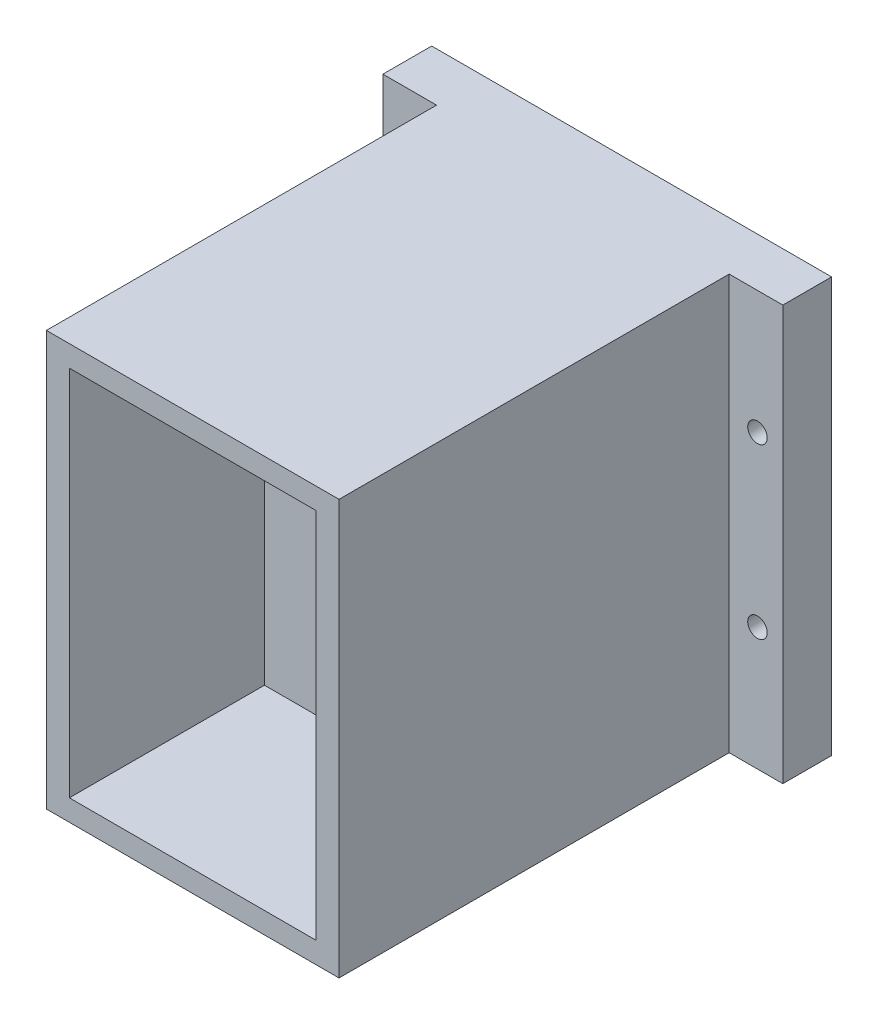
ISO-10303-21;
HEADER;
FILE_DESCRIPTION(('STEP AP214'),'2;1');
FILE_NAME('part.step','',(''),(''),'','','');
FILE_SCHEMA(('AUTOMOTIVE_DESIGN { 1 0 10303 214 1 1 1 1 }'));
ENDSEC;
DATA;
#1=APPLICATION_CONTEXT('core data for automotive mechanical design processes');
#2=APPLICATION_PROTOCOL_DEFINITION('international standard','automotive_design',2000,#1);
#3=PRODUCT_CONTEXT('',#1,'mechanical');
#4=PRODUCT('Part','Part','',(#3));
#5=PRODUCT_RELATED_PRODUCT_CATEGORY('part','',(#4));
#6=PRODUCT_DEFINITION_FORMATION('','',#4);
#7=PRODUCT_DEFINITION_CONTEXT('part definition',#1,'design');
#8=PRODUCT_DEFINITION('design','',#6,#7);
#9=PRODUCT_DEFINITION_SHAPE('','',#8);
#10=(LENGTH_UNIT() NAMED_UNIT(*) SI_UNIT(.MILLI.,.METRE.));
#11=(NAMED_UNIT(*) PLANE_ANGLE_UNIT() SI_UNIT($,.RADIAN.));
#12=(NAMED_UNIT(*) SI_UNIT($,.STERADIAN.) SOLID_ANGLE_UNIT());
#13=UNCERTAINTY_MEASURE_WITH_UNIT(LENGTH_MEASURE(1.E-05),#10,'distance_accuracy_value','');
#14=(GEOMETRIC_REPRESENTATION_CONTEXT(3) GLOBAL_UNCERTAINTY_ASSIGNED_CONTEXT((#13)) GLOBAL_UNIT_ASSIGNED_CONTEXT((#10,
#11,#12)) REPRESENTATION_CONTEXT('',''));
#15=CARTESIAN_POINT('',(0.,0.,0.));
#16=DIRECTION('',(0.,0.,1.));
#17=DIRECTION('',(1.,0.,0.));
#18=AXIS2_PLACEMENT_3D('',#15,#16,#17);
#19=CARTESIAN_POINT('',(-15.,-21.25,40.));
#20=DIRECTION('',(1.,0.,0.));
#21=DIRECTION('',(0.,0.,-1.));
#22=AXIS2_PLACEMENT_3D('',#19,#20,#21);
#23=PLANE('',#22);
#24=DIRECTION('',(0.,-1.,0.));
#25=VECTOR('',#24,1.);
#26=CARTESIAN_POINT('',(-15.,-21.25,0.));
#27=LINE('',#26,#25);
#28=CARTESIAN_POINT('',(-15.,21.25,0.));
#29=VERTEX_POINT('',#28);
#30=CARTESIAN_POINT('',(-15.,-21.25,0.));
#31=VERTEX_POINT('',#30);
#32=EDGE_CURVE('E136',#29,#31,#27,.T.);
#33=ORIENTED_EDGE('',*,*,#32,.T.);
#34=DIRECTION('',(0.,0.,-1.));
#35=VECTOR('',#34,1.);
#36=CARTESIAN_POINT('',(-15.,-21.25,40.));
#37=LINE('',#36,#35);
#38=CARTESIAN_POINT('',(-15.,-21.25,40.));
#39=VERTEX_POINT('',#38);
#40=EDGE_CURVE('E11',#39,#31,#37,.T.);
#41=ORIENTED_EDGE('',*,*,#40,.F.);
#42=DIRECTION('',(0.,-1.,0.));
#43=VECTOR('',#42,1.);
#44=CARTESIAN_POINT('',(-15.,-21.25,40.));
#45=LINE('',#44,#43);
#46=CARTESIAN_POINT('',(-15.,21.25,40.));
#47=VERTEX_POINT('',#46);
#48=EDGE_CURVE('E112',#47,#39,#45,.T.);
#49=ORIENTED_EDGE('',*,*,#48,.F.);
#50=DIRECTION('',(0.,0.,-1.));
#51=VECTOR('',#50,1.);
#52=CARTESIAN_POINT('',(-15.,21.25,40.));
#53=LINE('',#52,#51);
#54=EDGE_CURVE('E132',#47,#29,#53,.T.);
#55=ORIENTED_EDGE('',*,*,#54,.T.);
#56=EDGE_LOOP('',(#33,#41,#49,#55));
#57=FACE_BOUND('',#56,.T.);
#58=ADVANCED_FACE('F40',(#57),#23,.F.);
#59=CARTESIAN_POINT('',(15.,-21.25,40.));
#60=DIRECTION('',(0.,1.,0.));
#61=DIRECTION('',(-1.,0.,0.));
#62=AXIS2_PLACEMENT_3D('',#59,#60,#61);
#63=PLANE('',#62);
#64=ORIENTED_EDGE('',*,*,#40,.T.);
#65=DIRECTION('',(-1.,0.,0.));
#66=VECTOR('',#65,1.);
#67=CARTESIAN_POINT('',(-20.5,-21.25,0.));
#68=LINE('',#67,#66);
#69=CARTESIAN_POINT('',(-20.5,-21.25,0.));
#70=VERTEX_POINT('',#69);
#71=EDGE_CURVE('E224',#31,#70,#68,.T.);
#72=ORIENTED_EDGE('',*,*,#71,.T.);
#73=DIRECTION('',(0.,0.,1.));
#74=VECTOR('',#73,1.);
#75=CARTESIAN_POINT('',(-20.5,-21.25,-5.));
#76=LINE('',#75,#74);
#77=CARTESIAN_POINT('',(-20.5,-21.25,-5.));
#78=VERTEX_POINT('',#77);
#79=EDGE_CURVE('E216',#78,#70,#76,.T.);
#80=ORIENTED_EDGE('',*,*,#79,.F.);
#81=DIRECTION('',(-1.,0.,0.));
#82=VECTOR('',#81,1.);
#83=CARTESIAN_POINT('',(-20.5,-21.25,-5.));
#84=LINE('',#83,#82);
#85=CARTESIAN_POINT('',(20.5,-21.25,-5.));
#86=VERTEX_POINT('',#85);
#87=EDGE_CURVE('E220',#86,#78,#84,.T.);
#88=ORIENTED_EDGE('',*,*,#87,.F.);
#89=DIRECTION('',(0.,0.,1.));
#90=VECTOR('',#89,1.);
#91=CARTESIAN_POINT('',(20.5,-21.25,-5.));
#92=LINE('',#91,#90);
#93=CARTESIAN_POINT('',(20.5,-21.25,0.));
#94=VERTEX_POINT('',#93);
#95=EDGE_CURVE('E213',#86,#94,#92,.T.);
#96=ORIENTED_EDGE('',*,*,#95,.T.);
#97=CARTESIAN_POINT('',(15.,-21.25,0.));
#98=VERTEX_POINT('',#97);
#99=EDGE_CURVE('E123',#94,#98,#68,.T.);
#100=ORIENTED_EDGE('',*,*,#99,.T.);
#101=DIRECTION('',(0.,0.,-1.));
#102=VECTOR('',#101,1.);
#103=CARTESIAN_POINT('',(15.,-21.25,40.));
#104=LINE('',#103,#102);
#105=CARTESIAN_POINT('',(15.,-21.25,40.));
#106=VERTEX_POINT('',#105);
#107=EDGE_CURVE('E49',#106,#98,#104,.T.);
#108=ORIENTED_EDGE('',*,*,#107,.F.);
#109=DIRECTION('',(1.,0.,0.));
#110=VECTOR('',#109,1.);
#111=CARTESIAN_POINT('',(15.,-21.25,40.));
#112=LINE('',#111,#110);
#113=EDGE_CURVE('E105',#39,#106,#112,.T.);
#114=ORIENTED_EDGE('',*,*,#113,.F.);
#115=EDGE_LOOP('',(#64,#72,#80,#88,#96,#100,#108,#114));
#116=FACE_BOUND('',#115,.T.);
#117=ADVANCED_FACE('F119',(#116),#63,.F.);
#118=CARTESIAN_POINT('',(15.,-21.25,40.));
#119=DIRECTION('',(-1.,0.,0.));
#120=DIRECTION('',(0.,0.,1.));
#121=AXIS2_PLACEMENT_3D('',#118,#119,#120);
#122=PLANE('',#121);
#123=DIRECTION('',(0.,1.,0.));
#124=VECTOR('',#123,1.);
#125=CARTESIAN_POINT('',(15.,-21.25,0.));
#126=LINE('',#125,#124);
#127=CARTESIAN_POINT('',(15.,21.25,0.));
#128=VERTEX_POINT('',#127);
#129=EDGE_CURVE('E140',#98,#128,#126,.T.);
#130=ORIENTED_EDGE('',*,*,#129,.T.);
#131=DIRECTION('',(0.,0.,-1.));
#132=VECTOR('',#131,1.);
#133=CARTESIAN_POINT('',(15.,21.25,40.));
#134=LINE('',#133,#132);
#135=CARTESIAN_POINT('',(15.,21.25,40.));
#136=VERTEX_POINT('',#135);
#137=EDGE_CURVE('E126',#136,#128,#134,.T.);
#138=ORIENTED_EDGE('',*,*,#137,.F.);
#139=DIRECTION('',(0.,1.,0.));
#140=VECTOR('',#139,1.);
#141=CARTESIAN_POINT('',(15.,-21.25,40.));
#142=LINE('',#141,#140);
#143=EDGE_CURVE('E109',#106,#136,#142,.T.);
#144=ORIENTED_EDGE('',*,*,#143,.F.);
#145=ORIENTED_EDGE('',*,*,#107,.T.);
#146=EDGE_LOOP('',(#130,#138,#144,#145));
#147=FACE_BOUND('',#146,.T.);
#148=ADVANCED_FACE('F127',(#147),#122,.F.);
#149=CARTESIAN_POINT('',(15.,21.25,40.));
#150=DIRECTION('',(0.,-1.,0.));
#151=DIRECTION('',(1.,0.,0.));
#152=AXIS2_PLACEMENT_3D('',#149,#150,#151);
#153=PLANE('',#152);
#154=ORIENTED_EDGE('',*,*,#137,.T.);
#155=DIRECTION('',(1.,0.,0.));
#156=VECTOR('',#155,1.);
#157=CARTESIAN_POINT('',(20.5,21.25,0.));
#158=LINE('',#157,#156);
#159=CARTESIAN_POINT('',(20.5,21.25,0.));
#160=VERTEX_POINT('',#159);
#161=EDGE_CURVE('E78',#128,#160,#158,.T.);
#162=ORIENTED_EDGE('',*,*,#161,.T.);
#163=DIRECTION('',(0.,0.,1.));
#164=VECTOR('',#163,1.);
#165=CARTESIAN_POINT('',(20.5,21.25,-5.));
#166=LINE('',#165,#164);
#167=CARTESIAN_POINT('',(20.5,21.25,-5.));
#168=VERTEX_POINT('',#167);
#169=EDGE_CURVE('E210',#168,#160,#166,.T.);
#170=ORIENTED_EDGE('',*,*,#169,.F.);
#171=DIRECTION('',(1.,0.,0.));
#172=VECTOR('',#171,1.);
#173=CARTESIAN_POINT('',(20.5,21.25,-5.));
#174=LINE('',#173,#172);
#175=CARTESIAN_POINT('',(-20.5,21.25,-5.));
#176=VERTEX_POINT('',#175);
#177=EDGE_CURVE('E243',#176,#168,#174,.T.);
#178=ORIENTED_EDGE('',*,*,#177,.F.);
#179=DIRECTION('',(0.,0.,1.));
#180=VECTOR('',#179,1.);
#181=CARTESIAN_POINT('',(-20.5,21.25,-5.));
#182=LINE('',#181,#180);
#183=CARTESIAN_POINT('',(-20.5,21.25,0.));
#184=VERTEX_POINT('',#183);
#185=EDGE_CURVE('E204',#176,#184,#182,.T.);
#186=ORIENTED_EDGE('',*,*,#185,.T.);
#187=EDGE_CURVE('E155',#184,#29,#158,.T.);
#188=ORIENTED_EDGE('',*,*,#187,.T.);
#189=ORIENTED_EDGE('',*,*,#54,.F.);
#190=DIRECTION('',(-1.,0.,0.));
#191=VECTOR('',#190,1.);
#192=CARTESIAN_POINT('',(15.,21.25,40.));
#193=LINE('',#192,#191);
#194=EDGE_CURVE('E65',#136,#47,#193,.T.);
#195=ORIENTED_EDGE('',*,*,#194,.F.);
#196=EDGE_LOOP('',(#154,#162,#170,#178,#186,#188,#189,#195));
#197=FACE_BOUND('',#196,.T.);
#198=ADVANCED_FACE('F148',(#197),#153,.F.);
#199=CARTESIAN_POINT('',(0.,0.,40.));
#200=DIRECTION('',(0.,0.,1.));
#201=DIRECTION('',(1.,0.,0.));
#202=AXIS2_PLACEMENT_3D('',#199,#200,#201);
#203=PLANE('',#202);
#204=DIRECTION('',(0.,1.,0.));
#205=VECTOR('',#204,1.);
#206=CARTESIAN_POINT('',(12.6455496348924,-19.0768699427671,40.));
#207=LINE('',#206,#205);
#208=CARTESIAN_POINT('',(12.6455496348924,-19.0768699427671,40.));
#209=VERTEX_POINT('',#208);
#210=CARTESIAN_POINT('',(12.6455496348924,19.0768699427671,40.));
#211=VERTEX_POINT('',#210);
#212=EDGE_CURVE('E56',#209,#211,#207,.T.);
#213=ORIENTED_EDGE('',*,*,#212,.F.);
#214=DIRECTION('',(1.,0.,0.));
#215=VECTOR('',#214,1.);
#216=CARTESIAN_POINT('',(-12.6455496348924,-19.0768699427671,40.));
#217=LINE('',#216,#215);
#218=CARTESIAN_POINT('',(-12.6455496348924,-19.0768699427671,40.));
#219=VERTEX_POINT('',#218);
#220=EDGE_CURVE('E171',#219,#209,#217,.T.);
#221=ORIENTED_EDGE('',*,*,#220,.F.);
#222=DIRECTION('',(0.,-1.,0.));
#223=VECTOR('',#222,1.);
#224=CARTESIAN_POINT('',(-12.6455496348924,-19.0768699427671,40.));
#225=LINE('',#224,#223);
#226=CARTESIAN_POINT('',(-12.6455496348924,19.0768699427671,40.));
#227=VERTEX_POINT('',#226);
#228=EDGE_CURVE('E175',#227,#219,#225,.T.);
#229=ORIENTED_EDGE('',*,*,#228,.F.);
#230=DIRECTION('',(-1.,0.,0.));
#231=VECTOR('',#230,1.);
#232=CARTESIAN_POINT('',(-12.6455496348924,19.0768699427671,40.));
#233=LINE('',#232,#231);
#234=EDGE_CURVE('E179',#211,#227,#233,.T.);
#235=ORIENTED_EDGE('',*,*,#234,.F.);
#236=EDGE_LOOP('',(#213,#221,#229,#235));
#237=FACE_BOUND('',#236,.T.);
#238=ORIENTED_EDGE('',*,*,#48,.T.);
#239=ORIENTED_EDGE('',*,*,#113,.T.);
#240=ORIENTED_EDGE('',*,*,#143,.T.);
#241=ORIENTED_EDGE('',*,*,#194,.T.);
#242=EDGE_LOOP('',(#238,#239,#240,#241));
#243=FACE_BOUND('',#242,.T.);
#244=ADVANCED_FACE('F107',(#237,#243),#203,.T.);
#245=CARTESIAN_POINT('',(12.6455496348924,-19.0768699427671,20.));
#246=DIRECTION('',(1.,0.,0.));
#247=DIRECTION('',(0.,0.,-1.));
#248=AXIS2_PLACEMENT_3D('',#245,#246,#247);
#249=PLANE('',#248);
#250=ORIENTED_EDGE('',*,*,#212,.T.);
#251=DIRECTION('',(0.,0.,1.));
#252=VECTOR('',#251,1.);
#253=CARTESIAN_POINT('',(12.6455496348924,19.0768699427671,20.));
#254=LINE('',#253,#252);
#255=CARTESIAN_POINT('',(12.6455496348924,19.0768699427671,20.));
#256=VERTEX_POINT('',#255);
#257=EDGE_CURVE('E159',#256,#211,#254,.T.);
#258=ORIENTED_EDGE('',*,*,#257,.F.);
#259=DIRECTION('',(0.,1.,0.));
#260=VECTOR('',#259,1.);
#261=CARTESIAN_POINT('',(12.6455496348924,-19.0768699427671,20.));
#262=LINE('',#261,#260);
#263=CARTESIAN_POINT('',(12.6455496348924,-19.0768699427671,20.));
#264=VERTEX_POINT('',#263);
#265=EDGE_CURVE('E174',#264,#256,#262,.T.);
#266=ORIENTED_EDGE('',*,*,#265,.F.);
#267=DIRECTION('',(0.,0.,1.));
#268=VECTOR('',#267,1.);
#269=CARTESIAN_POINT('',(12.6455496348924,-19.0768699427671,20.));
#270=LINE('',#269,#268);
#271=EDGE_CURVE('E88',#264,#209,#270,.T.);
#272=ORIENTED_EDGE('',*,*,#271,.T.);
#273=EDGE_LOOP('',(#250,#258,#266,#272));
#274=FACE_BOUND('',#273,.T.);
#275=ADVANCED_FACE('F319',(#274),#249,.F.);
#276=CARTESIAN_POINT('',(-12.6455496348924,-19.0768699427671,20.));
#277=DIRECTION('',(0.,-1.,0.));
#278=DIRECTION('',(0.,0.,-1.));
#279=AXIS2_PLACEMENT_3D('',#276,#277,#278);
#280=PLANE('',#279);
#281=ORIENTED_EDGE('',*,*,#220,.T.);
#282=ORIENTED_EDGE('',*,*,#271,.F.);
#283=DIRECTION('',(1.,0.,0.));
#284=VECTOR('',#283,1.);
#285=CARTESIAN_POINT('',(-12.6455496348924,-19.0768699427671,20.));
#286=LINE('',#285,#284);
#287=CARTESIAN_POINT('',(-12.6455496348924,-19.0768699427671,20.));
#288=VERTEX_POINT('',#287);
#289=EDGE_CURVE('E163',#288,#264,#286,.T.);
#290=ORIENTED_EDGE('',*,*,#289,.F.);
#291=DIRECTION('',(0.,0.,1.));
#292=VECTOR('',#291,1.);
#293=CARTESIAN_POINT('',(-12.6455496348924,-19.0768699427671,20.));
#294=LINE('',#293,#292);
#295=EDGE_CURVE('E166',#288,#219,#294,.T.);
#296=ORIENTED_EDGE('',*,*,#295,.T.);
#297=EDGE_LOOP('',(#281,#282,#290,#296));
#298=FACE_BOUND('',#297,.T.);
#299=ADVANCED_FACE('F323',(#298),#280,.F.);
#300=CARTESIAN_POINT('',(-12.6455496348924,-19.0768699427671,20.));
#301=DIRECTION('',(-1.,0.,0.));
#302=DIRECTION('',(0.,0.,1.));
#303=AXIS2_PLACEMENT_3D('',#300,#301,#302);
#304=PLANE('',#303);
#305=ORIENTED_EDGE('',*,*,#228,.T.);
#306=ORIENTED_EDGE('',*,*,#295,.F.);
#307=DIRECTION('',(0.,-1.,0.));
#308=VECTOR('',#307,1.);
#309=CARTESIAN_POINT('',(-12.6455496348924,-19.0768699427671,20.));
#310=LINE('',#309,#308);
#311=CARTESIAN_POINT('',(-12.6455496348924,19.0768699427671,20.));
#312=VERTEX_POINT('',#311);
#313=EDGE_CURVE('E189',#312,#288,#310,.T.);
#314=ORIENTED_EDGE('',*,*,#313,.F.);
#315=DIRECTION('',(0.,0.,1.));
#316=VECTOR('',#315,1.);
#317=CARTESIAN_POINT('',(-12.6455496348924,19.0768699427671,20.));
#318=LINE('',#317,#316);
#319=EDGE_CURVE('E162',#312,#227,#318,.T.);
#320=ORIENTED_EDGE('',*,*,#319,.T.);
#321=EDGE_LOOP('',(#305,#306,#314,#320));
#322=FACE_BOUND('',#321,.T.);
#323=ADVANCED_FACE('F328',(#322),#304,.F.);
#324=CARTESIAN_POINT('',(-12.6455496348924,19.0768699427671,20.));
#325=DIRECTION('',(0.,1.,0.));
#326=DIRECTION('',(0.,0.,1.));
#327=AXIS2_PLACEMENT_3D('',#324,#325,#326);
#328=PLANE('',#327);
#329=ORIENTED_EDGE('',*,*,#234,.T.);
#330=ORIENTED_EDGE('',*,*,#319,.F.);
#331=DIRECTION('',(-1.,0.,0.));
#332=VECTOR('',#331,1.);
#333=CARTESIAN_POINT('',(-12.6455496348924,19.0768699427671,20.));
#334=LINE('',#333,#332);
#335=EDGE_CURVE('E193',#256,#312,#334,.T.);
#336=ORIENTED_EDGE('',*,*,#335,.F.);
#337=ORIENTED_EDGE('',*,*,#257,.T.);
#338=EDGE_LOOP('',(#329,#330,#336,#337));
#339=FACE_BOUND('',#338,.T.);
#340=ADVANCED_FACE('F324',(#339),#328,.F.);
#341=CARTESIAN_POINT('',(0.,0.,20.));
#342=DIRECTION('',(0.,0.,-1.));
#343=DIRECTION('',(-1.,0.,0.));
#344=AXIS2_PLACEMENT_3D('',#341,#342,#343);
#345=PLANE('',#344);
#346=ORIENTED_EDGE('',*,*,#265,.T.);
#347=ORIENTED_EDGE('',*,*,#335,.T.);
#348=ORIENTED_EDGE('',*,*,#313,.T.);
#349=ORIENTED_EDGE('',*,*,#289,.T.);
#350=EDGE_LOOP('',(#346,#347,#348,#349));
#351=FACE_BOUND('',#350,.T.);
#352=ADVANCED_FACE('F327',(#351),#345,.F.);
#353=CARTESIAN_POINT('',(-17.9,-8.65,-5.));
#354=DIRECTION('',(0.,0.,1.));
#355=DIRECTION('',(1.,0.,0.));
#356=AXIS2_PLACEMENT_3D('',#353,#354,#355);
#357=CYLINDRICAL_SURFACE('',#356,1.);
#358=CARTESIAN_POINT('',(-17.9,-8.65,-5.));
#359=DIRECTION('',(0.,0.,-1.));
#360=DIRECTION('',(1.,0.,0.));
#361=AXIS2_PLACEMENT_3D('',#358,#359,#360);
#362=CIRCLE('',#361,1.);
#363=CARTESIAN_POINT('',(-16.9,-8.65,-5.));
#364=VERTEX_POINT('',#363);
#365=EDGE_CURVE('E270',#364,#364,#362,.T.);
#366=ORIENTED_EDGE('',*,*,#365,.T.);
#367=EDGE_LOOP('',(#366));
#368=FACE_BOUND('',#367,.T.);
#369=CARTESIAN_POINT('',(-17.9,-8.65,0.));
#370=DIRECTION('',(0.,0.,-1.));
#371=DIRECTION('',(1.,0.,0.));
#372=AXIS2_PLACEMENT_3D('',#369,#370,#371);
#373=CIRCLE('',#372,1.);
#374=CARTESIAN_POINT('',(-16.9,-8.65,0.));
#375=VERTEX_POINT('',#374);
#376=EDGE_CURVE('E274',#375,#375,#373,.T.);
#377=ORIENTED_EDGE('',*,*,#376,.F.);
#378=EDGE_LOOP('',(#377));
#379=FACE_BOUND('',#378,.T.);
#380=ADVANCED_FACE('F282',(#368,#379),#357,.F.);
#381=CARTESIAN_POINT('',(17.9,-8.65,-5.));
#382=DIRECTION('',(0.,0.,1.));
#383=DIRECTION('',(1.,0.,0.));
#384=AXIS2_PLACEMENT_3D('',#381,#382,#383);
#385=CYLINDRICAL_SURFACE('',#384,1.);
#386=CARTESIAN_POINT('',(17.9,-8.65,-5.));
#387=DIRECTION('',(0.,0.,-1.));
#388=DIRECTION('',(-1.,0.,0.));
#389=AXIS2_PLACEMENT_3D('',#386,#387,#388);
#390=CIRCLE('',#389,1.);
#391=CARTESIAN_POINT('',(16.9,-8.65,-5.));
#392=VERTEX_POINT('',#391);
#393=EDGE_CURVE('E262',#392,#392,#390,.T.);
#394=ORIENTED_EDGE('',*,*,#393,.T.);
#395=EDGE_LOOP('',(#394));
#396=FACE_BOUND('',#395,.T.);
#397=CARTESIAN_POINT('',(17.9,-8.65,0.));
#398=DIRECTION('',(0.,0.,-1.));
#399=DIRECTION('',(-1.,0.,0.));
#400=AXIS2_PLACEMENT_3D('',#397,#398,#399);
#401=CIRCLE('',#400,1.);
#402=CARTESIAN_POINT('',(16.9,-8.65,0.));
#403=VERTEX_POINT('',#402);
#404=EDGE_CURVE('E266',#403,#403,#401,.T.);
#405=ORIENTED_EDGE('',*,*,#404,.F.);
#406=EDGE_LOOP('',(#405));
#407=FACE_BOUND('',#406,.T.);
#408=ADVANCED_FACE('F408',(#396,#407),#385,.F.);
#409=CARTESIAN_POINT('',(17.9,8.65,-5.));
#410=DIRECTION('',(0.,0.,1.));
#411=DIRECTION('',(1.,0.,0.));
#412=AXIS2_PLACEMENT_3D('',#409,#410,#411);
#413=CYLINDRICAL_SURFACE('',#412,1.);
#414=CARTESIAN_POINT('',(17.9,8.65,-5.));
#415=DIRECTION('',(0.,0.,-1.));
#416=DIRECTION('',(1.,0.,0.));
#417=AXIS2_PLACEMENT_3D('',#414,#415,#416);
#418=CIRCLE('',#417,1.);
#419=CARTESIAN_POINT('',(18.9,8.65,-5.));
#420=VERTEX_POINT('',#419);
#421=EDGE_CURVE('E254',#420,#420,#418,.T.);
#422=ORIENTED_EDGE('',*,*,#421,.T.);
#423=EDGE_LOOP('',(#422));
#424=FACE_BOUND('',#423,.T.);
#425=CARTESIAN_POINT('',(17.9,8.65,0.));
#426=DIRECTION('',(0.,0.,-1.));
#427=DIRECTION('',(1.,0.,0.));
#428=AXIS2_PLACEMENT_3D('',#425,#426,#427);
#429=CIRCLE('',#428,1.);
#430=CARTESIAN_POINT('',(18.9,8.65,0.));
#431=VERTEX_POINT('',#430);
#432=EDGE_CURVE('E258',#431,#431,#429,.T.);
#433=ORIENTED_EDGE('',*,*,#432,.F.);
#434=EDGE_LOOP('',(#433));
#435=FACE_BOUND('',#434,.T.);
#436=ADVANCED_FACE('F403',(#424,#435),#413,.F.);
#437=CARTESIAN_POINT('',(-17.9,8.65,-5.));
#438=DIRECTION('',(0.,0.,1.));
#439=DIRECTION('',(1.,0.,0.));
#440=AXIS2_PLACEMENT_3D('',#437,#438,#439);
#441=CYLINDRICAL_SURFACE('',#440,1.);
#442=CARTESIAN_POINT('',(-17.9,8.65,-5.));
#443=DIRECTION('',(0.,0.,-1.));
#444=DIRECTION('',(-1.,0.,0.));
#445=AXIS2_PLACEMENT_3D('',#442,#443,#444);
#446=CIRCLE('',#445,1.);
#447=CARTESIAN_POINT('',(-18.9,8.65,-5.));
#448=VERTEX_POINT('',#447);
#449=EDGE_CURVE('E235',#448,#448,#446,.T.);
#450=ORIENTED_EDGE('',*,*,#449,.T.);
#451=EDGE_LOOP('',(#450));
#452=FACE_BOUND('',#451,.T.);
#453=CARTESIAN_POINT('',(-17.9,8.65,0.));
#454=DIRECTION('',(0.,0.,-1.));
#455=DIRECTION('',(-1.,0.,0.));
#456=AXIS2_PLACEMENT_3D('',#453,#454,#455);
#457=CIRCLE('',#456,1.);
#458=CARTESIAN_POINT('',(-18.9,8.65,0.));
#459=VERTEX_POINT('',#458);
#460=EDGE_CURVE('E250',#459,#459,#457,.T.);
#461=ORIENTED_EDGE('',*,*,#460,.F.);
#462=EDGE_LOOP('',(#461));
#463=FACE_BOUND('',#462,.T.);
#464=ADVANCED_FACE('F347',(#452,#463),#441,.F.);
#465=CARTESIAN_POINT('',(20.5,21.25,-5.));
#466=DIRECTION('',(-1.,0.,0.));
#467=DIRECTION('',(0.,-1.,0.));
#468=AXIS2_PLACEMENT_3D('',#465,#466,#467);
#469=PLANE('',#468);
#470=DIRECTION('',(0.,-1.,0.));
#471=VECTOR('',#470,1.);
#472=CARTESIAN_POINT('',(20.5,21.25,0.));
#473=LINE('',#472,#471);
#474=EDGE_CURVE('E225',#160,#94,#473,.T.);
#475=ORIENTED_EDGE('',*,*,#474,.T.);
#476=ORIENTED_EDGE('',*,*,#95,.F.);
#477=DIRECTION('',(0.,-1.,0.));
#478=VECTOR('',#477,1.);
#479=CARTESIAN_POINT('',(20.5,21.25,-5.));
#480=LINE('',#479,#478);
#481=EDGE_CURVE('E239',#168,#86,#480,.T.);
#482=ORIENTED_EDGE('',*,*,#481,.F.);
#483=ORIENTED_EDGE('',*,*,#169,.T.);
#484=EDGE_LOOP('',(#475,#476,#482,#483));
#485=FACE_BOUND('',#484,.T.);
#486=ADVANCED_FACE('F299',(#485),#469,.F.);
#487=CARTESIAN_POINT('',(-20.5,21.25,-5.));
#488=DIRECTION('',(1.,0.,0.));
#489=DIRECTION('',(0.,1.,0.));
#490=AXIS2_PLACEMENT_3D('',#487,#488,#489);
#491=PLANE('',#490);
#492=DIRECTION('',(0.,1.,0.));
#493=VECTOR('',#492,1.);
#494=CARTESIAN_POINT('',(-20.5,21.25,0.));
#495=LINE('',#494,#493);
#496=EDGE_CURVE('E231',#70,#184,#495,.T.);
#497=ORIENTED_EDGE('',*,*,#496,.T.);
#498=ORIENTED_EDGE('',*,*,#185,.F.);
#499=DIRECTION('',(0.,1.,0.));
#500=VECTOR('',#499,1.);
#501=CARTESIAN_POINT('',(-20.5,21.25,-5.));
#502=LINE('',#501,#500);
#503=EDGE_CURVE('E223',#78,#176,#502,.T.);
#504=ORIENTED_EDGE('',*,*,#503,.F.);
#505=ORIENTED_EDGE('',*,*,#79,.T.);
#506=EDGE_LOOP('',(#497,#498,#504,#505));
#507=FACE_BOUND('',#506,.T.);
#508=ADVANCED_FACE('F288',(#507),#491,.F.);
#509=CARTESIAN_POINT('',(0.,0.,-5.));
#510=DIRECTION('',(0.,0.,1.));
#511=DIRECTION('',(1.,0.,0.));
#512=AXIS2_PLACEMENT_3D('',#509,#510,#511);
#513=PLANE('',#512);
#514=ORIENTED_EDGE('',*,*,#503,.T.);
#515=ORIENTED_EDGE('',*,*,#177,.T.);
#516=ORIENTED_EDGE('',*,*,#481,.T.);
#517=ORIENTED_EDGE('',*,*,#87,.T.);
#518=EDGE_LOOP('',(#514,#515,#516,#517));
#519=FACE_BOUND('',#518,.T.);
#520=ORIENTED_EDGE('',*,*,#449,.F.);
#521=EDGE_LOOP('',(#520));
#522=FACE_BOUND('',#521,.T.);
#523=ORIENTED_EDGE('',*,*,#421,.F.);
#524=EDGE_LOOP('',(#523));
#525=FACE_BOUND('',#524,.T.);
#526=ORIENTED_EDGE('',*,*,#393,.F.);
#527=EDGE_LOOP('',(#526));
#528=FACE_BOUND('',#527,.T.);
#529=ORIENTED_EDGE('',*,*,#365,.F.);
#530=EDGE_LOOP('',(#529));
#531=FACE_BOUND('',#530,.T.);
#532=ADVANCED_FACE('F285',(#519,#522,#525,#528,#531),#513,.F.);
#533=CARTESIAN_POINT('',(0.,0.,0.));
#534=DIRECTION('',(0.,0.,1.));
#535=DIRECTION('',(1.,0.,0.));
#536=AXIS2_PLACEMENT_3D('',#533,#534,#535);
#537=PLANE('',#536);
#538=ORIENTED_EDGE('',*,*,#432,.T.);
#539=EDGE_LOOP('',(#538));
#540=FACE_BOUND('',#539,.T.);
#541=ORIENTED_EDGE('',*,*,#404,.T.);
#542=EDGE_LOOP('',(#541));
#543=FACE_BOUND('',#542,.T.);
#544=ORIENTED_EDGE('',*,*,#129,.F.);
#545=ORIENTED_EDGE('',*,*,#99,.F.);
#546=ORIENTED_EDGE('',*,*,#474,.F.);
#547=ORIENTED_EDGE('',*,*,#161,.F.);
#548=EDGE_LOOP('',(#544,#545,#546,#547));
#549=FACE_BOUND('',#548,.T.);
#550=ADVANCED_FACE('F287',(#540,#543,#549),#537,.T.);
#551=ORIENTED_EDGE('',*,*,#376,.T.);
#552=EDGE_LOOP('',(#551));
#553=FACE_BOUND('',#552,.T.);
#554=ORIENTED_EDGE('',*,*,#460,.T.);
#555=EDGE_LOOP('',(#554));
#556=FACE_BOUND('',#555,.T.);
#557=ORIENTED_EDGE('',*,*,#32,.F.);
#558=ORIENTED_EDGE('',*,*,#187,.F.);
#559=ORIENTED_EDGE('',*,*,#496,.F.);
#560=ORIENTED_EDGE('',*,*,#71,.F.);
#561=EDGE_LOOP('',(#557,#558,#559,#560));
#562=FACE_BOUND('',#561,.T.);
#563=ADVANCED_FACE('F295',(#553,#556,#562),#537,.T.);
#564=CLOSED_SHELL('',(#58,#117,#148,#198,#244,#275,#299,#323,#340,#352,#380,#408,#436,#464,#486,
#508,#532,#550,#563));
#565=CARTESIAN_POINT('',(0.,0.,1.));
#566=DIRECTION('',(0.,0.,-1.));
#567=DIRECTION('',(-1.,0.,0.));
#568=AXIS2_PLACEMENT_3D('',#565,#566,#567);
#569=PLANE('',#568);
#570=CARTESIAN_POINT('',(0.,0.,1.));
#571=DIRECTION('',(0.,0.,-1.));
#572=DIRECTION('',(-1.,0.,0.));
#573=AXIS2_PLACEMENT_3D('',#570,#571,#572);
#574=CIRCLE('',#573,10.);
#575=CARTESIAN_POINT('',(-10.,0.,1.));
#576=VERTEX_POINT('',#575);
#577=EDGE_CURVE('E185',#576,#576,#574,.T.);
#578=ORIENTED_EDGE('',*,*,#577,.T.);
#579=EDGE_LOOP('',(#578));
#580=FACE_BOUND('',#579,.T.);
#581=ADVANCED_FACE('F341',(#580),#569,.T.);
#582=CARTESIAN_POINT('',(0.,0.,1.));
#583=DIRECTION('',(0.,0.,-1.));
#584=DIRECTION('',(-1.,0.,0.));
#585=AXIS2_PLACEMENT_3D('',#582,#583,#584);
#586=CYLINDRICAL_SURFACE('',#585,10.);
#587=ORIENTED_EDGE('',*,*,#577,.F.);
#588=EDGE_LOOP('',(#587));
#589=FACE_BOUND('',#588,.T.);
#590=CARTESIAN_POINT('',(0.,0.,0.));
#591=DIRECTION('',(0.,0.,-1.));
#592=DIRECTION('',(-1.,0.,0.));
#593=AXIS2_PLACEMENT_3D('',#590,#591,#592);
#594=CIRCLE('',#593,10.);
#595=CARTESIAN_POINT('',(-10.,0.,0.));
#596=VERTEX_POINT('',#595);
#597=EDGE_CURVE('E200',#596,#596,#594,.T.);
#598=ORIENTED_EDGE('',*,*,#597,.T.);
#599=EDGE_LOOP('',(#598));
#600=FACE_BOUND('',#599,.T.);
#601=ADVANCED_FACE('F338',(#589,#600),#586,.F.);
#602=ORIENTED_EDGE('',*,*,#597,.F.);
#603=EDGE_LOOP('',(#602));
#604=FACE_BOUND('',#603,.T.);
#605=ADVANCED_FACE('F298',(#604),#537,.T.);
#606=CLOSED_SHELL('',(#581,#601,#605));
#607=ORIENTED_CLOSED_SHELL('',*,#606,.T.);
#608=BREP_WITH_VOIDS('B2',#564,(#607));
#609=ADVANCED_BREP_SHAPE_REPRESENTATION('',(#18,#608),#14);
#610=SHAPE_DEFINITION_REPRESENTATION(#9,#609);
ENDSEC;
END-ISO-10303-21;
